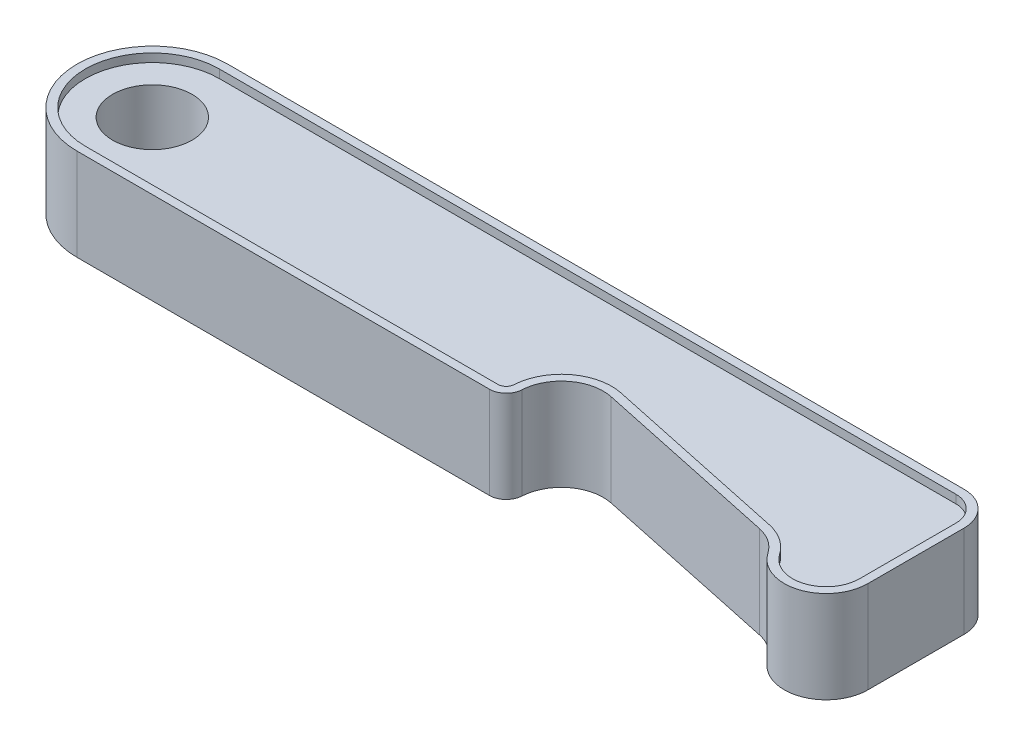
ISO-10303-21;
HEADER;
FILE_DESCRIPTION(('STEP AP214'),'2;1');
FILE_NAME('part.step','',(''),(''),'','','');
FILE_SCHEMA(('AUTOMOTIVE_DESIGN { 1 0 10303 214 1 1 1 1 }'));
ENDSEC;
DATA;
#1=APPLICATION_CONTEXT('core data for automotive mechanical design processes');
#2=APPLICATION_PROTOCOL_DEFINITION('international standard','automotive_design',2000,#1);
#3=PRODUCT_CONTEXT('',#1,'mechanical');
#4=PRODUCT('Part','Part','',(#3));
#5=PRODUCT_RELATED_PRODUCT_CATEGORY('part','',(#4));
#6=PRODUCT_DEFINITION_FORMATION('','',#4);
#7=PRODUCT_DEFINITION_CONTEXT('part definition',#1,'design');
#8=PRODUCT_DEFINITION('design','',#6,#7);
#9=PRODUCT_DEFINITION_SHAPE('','',#8);
#10=(LENGTH_UNIT() NAMED_UNIT(*) SI_UNIT(.MILLI.,.METRE.));
#11=(NAMED_UNIT(*) PLANE_ANGLE_UNIT() SI_UNIT($,.RADIAN.));
#12=(NAMED_UNIT(*) SI_UNIT($,.STERADIAN.) SOLID_ANGLE_UNIT());
#13=UNCERTAINTY_MEASURE_WITH_UNIT(LENGTH_MEASURE(1.E-05),#10,'distance_accuracy_value','');
#14=(GEOMETRIC_REPRESENTATION_CONTEXT(3) GLOBAL_UNCERTAINTY_ASSIGNED_CONTEXT((#13)) GLOBAL_UNIT_ASSIGNED_CONTEXT((#10,
#11,#12)) REPRESENTATION_CONTEXT('',''));
#15=CARTESIAN_POINT('',(0.,0.,0.));
#16=DIRECTION('',(0.,0.,1.));
#17=DIRECTION('',(1.,0.,0.));
#18=AXIS2_PLACEMENT_3D('',#15,#16,#17);
#19=CARTESIAN_POINT('',(-37.8170068432019,11.,-3.49425505754596));
#20=DIRECTION('',(0.,-1.,0.));
#21=DIRECTION('',(0.,0.,-1.));
#22=AXIS2_PLACEMENT_3D('',#19,#20,#21);
#23=CYLINDRICAL_SURFACE('',#22,4.75);
#24=CARTESIAN_POINT('',(-37.8170068432019,10.,-3.49425505754596));
#25=DIRECTION('',(0.,1.,0.));
#26=DIRECTION('',(0.,0.,1.));
#27=AXIS2_PLACEMENT_3D('',#24,#25,#26);
#28=CIRCLE('',#27,4.75);
#29=CARTESIAN_POINT('',(-37.8170068432019,10.,1.25574494245404));
#30=VERTEX_POINT('',#29);
#31=EDGE_CURVE('E356',#30,#30,#28,.F.);
#32=ORIENTED_EDGE('',*,*,#31,.F.);
#33=EDGE_LOOP('',(#32));
#34=FACE_BOUND('',#33,.T.);
#35=CARTESIAN_POINT('',(-37.8170068432019,1.,-3.49425505754596));
#36=DIRECTION('',(0.,-1.,0.));
#37=DIRECTION('',(0.,0.,-1.));
#38=AXIS2_PLACEMENT_3D('',#35,#36,#37);
#39=CIRCLE('',#38,4.75);
#40=CARTESIAN_POINT('',(-37.8170068432019,1.,-8.24425505754595));
#41=VERTEX_POINT('',#40);
#42=EDGE_CURVE('E285',#41,#41,#39,.F.);
#43=ORIENTED_EDGE('',*,*,#42,.F.);
#44=EDGE_LOOP('',(#43));
#45=FACE_BOUND('',#44,.T.);
#46=ADVANCED_FACE('F70',(#34,#45),#23,.F.);
#47=CARTESIAN_POINT('',(50.1829931567981,0.,-8.49425505754595));
#48=DIRECTION('',(0.,1.,0.));
#49=DIRECTION('',(0.,0.,1.));
#50=AXIS2_PLACEMENT_3D('',#47,#48,#49);
#51=PLANE('',#50);
#52=DIRECTION('',(1.,0.,0.));
#53=VECTOR('',#52,1.);
#54=CARTESIAN_POINT('',(-37.8170068432019,0.,-12.494255057546));
#55=LINE('',#54,#53);
#56=CARTESIAN_POINT('',(-37.8170068432019,0.,-12.494255057546));
#57=VERTEX_POINT('',#56);
#58=CARTESIAN_POINT('',(50.1829931567981,0.,-12.494255057546));
#59=VERTEX_POINT('',#58);
#60=EDGE_CURVE('E418',#57,#59,#55,.T.);
#61=ORIENTED_EDGE('',*,*,#60,.T.);
#62=CARTESIAN_POINT('',(50.1829931567981,0.,-8.49425505754595));
#63=DIRECTION('',(0.,1.,0.));
#64=DIRECTION('',(0.,0.,1.));
#65=AXIS2_PLACEMENT_3D('',#62,#63,#64);
#66=CIRCLE('',#65,4.00000000000001);
#67=CARTESIAN_POINT('',(54.1829931567981,0.,-8.49425505754595));
#68=VERTEX_POINT('',#67);
#69=EDGE_CURVE('E462',#68,#59,#66,.T.);
#70=ORIENTED_EDGE('',*,*,#69,.F.);
#71=DIRECTION('',(0.,0.,-1.));
#72=VECTOR('',#71,1.);
#73=CARTESIAN_POINT('',(54.1829931567981,0.,3.00574494245405));
#74=LINE('',#73,#72);
#75=CARTESIAN_POINT('',(54.1829931567981,0.,3.00574494245405));
#76=VERTEX_POINT('',#75);
#77=EDGE_CURVE('E465',#76,#68,#74,.T.);
#78=ORIENTED_EDGE('',*,*,#77,.F.);
#79=CARTESIAN_POINT('',(49.1829931567981,0.,3.00574494245405));
#80=DIRECTION('',(0.,1.,0.));
#81=DIRECTION('',(0.,0.,1.));
#82=AXIS2_PLACEMENT_3D('',#79,#80,#81);
#83=CIRCLE('',#82,5.);
#84=CARTESIAN_POINT('',(45.0673633932524,0.,5.84503915922999));
#85=VERTEX_POINT('',#84);
#86=EDGE_CURVE('E467',#85,#76,#83,.T.);
#87=ORIENTED_EDGE('',*,*,#86,.F.);
#88=CARTESIAN_POINT('',(40.9517336297068,0.,8.68433337600594));
#89=DIRECTION('',(0.,1.,0.));
#90=DIRECTION('',(0.,0.,1.));
#91=AXIS2_PLACEMENT_3D('',#88,#89,#90);
#92=CIRCLE('',#91,5.);
#93=CARTESIAN_POINT('',(41.9912920837956,0.,3.79359537233691));
#94=VERTEX_POINT('',#93);
#95=EDGE_CURVE('E469',#85,#94,#92,.T.);
#96=ORIENTED_EDGE('',*,*,#95,.T.);
#97=DIRECTION('',(0.978147600733805,0.,0.20791169081776));
#98=VECTOR('',#97,1.);
#99=CARTESIAN_POINT('',(19.4912920837956,0.,-0.988927265238599));
#100=LINE('',#99,#98);
#101=CARTESIAN_POINT('',(19.4912920837956,0.,-0.988927265238596));
#102=VERTEX_POINT('',#101);
#103=EDGE_CURVE('E472',#102,#94,#100,.T.);
#104=ORIENTED_EDGE('',*,*,#103,.F.);
#105=CARTESIAN_POINT('',(18.4517336297068,0.,3.90181073843043));
#106=DIRECTION('',(0.,1.,0.));
#107=DIRECTION('',(0.,0.,1.));
#108=AXIS2_PLACEMENT_3D('',#105,#106,#107);
#109=CIRCLE('',#108,5.);
#110=CARTESIAN_POINT('',(13.4597435207843,0.,3.6189065984473));
#111=VERTEX_POINT('',#110);
#112=EDGE_CURVE('E475',#102,#111,#109,.T.);
#113=ORIENTED_EDGE('',*,*,#112,.T.);
#114=CARTESIAN_POINT('',(11.4629474772153,0.,3.50574494245404));
#115=DIRECTION('',(0.,1.,0.));
#116=DIRECTION('',(0.,0.,1.));
#117=AXIS2_PLACEMENT_3D('',#114,#115,#116);
#118=CIRCLE('',#117,2.);
#119=CARTESIAN_POINT('',(11.4629474772153,0.,5.50574494245404));
#120=VERTEX_POINT('',#119);
#121=EDGE_CURVE('E478',#120,#111,#118,.T.);
#122=ORIENTED_EDGE('',*,*,#121,.F.);
#123=DIRECTION('',(1.,0.,0.));
#124=VECTOR('',#123,1.);
#125=CARTESIAN_POINT('',(-37.8170068432019,0.,5.50574494245404));
#126=LINE('',#125,#124);
#127=CARTESIAN_POINT('',(-37.8170068432019,0.,5.50574494245404));
#128=VERTEX_POINT('',#127);
#129=EDGE_CURVE('E481',#128,#120,#126,.T.);
#130=ORIENTED_EDGE('',*,*,#129,.F.);
#131=CARTESIAN_POINT('',(-37.8170068432019,0.,-3.49425505754596));
#132=DIRECTION('',(0.,1.,0.));
#133=DIRECTION('',(0.,0.,1.));
#134=AXIS2_PLACEMENT_3D('',#131,#132,#133);
#135=CIRCLE('',#134,9.);
#136=EDGE_CURVE('E440',#57,#128,#135,.T.);
#137=ORIENTED_EDGE('',*,*,#136,.F.);
#138=EDGE_LOOP('',(#61,#70,#78,#87,#96,#104,#113,#122,#130,#137));
#139=FACE_BOUND('',#138,.T.);
#140=CARTESIAN_POINT('',(18.4517336297068,0.,3.90181073843043));
#141=DIRECTION('',(0.,-1.,0.));
#142=DIRECTION('',(0.,0.,-1.));
#143=AXIS2_PLACEMENT_3D('',#140,#141,#142);
#144=CIRCLE('',#143,6.);
#145=CARTESIAN_POINT('',(12.4613454989998,0.,3.56232577045067));
#146=VERTEX_POINT('',#145);
#147=CARTESIAN_POINT('',(19.6992037746134,0.,-1.9670748659724));
#148=VERTEX_POINT('',#147);
#149=EDGE_CURVE('E87',#146,#148,#144,.T.);
#150=ORIENTED_EDGE('',*,*,#149,.T.);
#151=DIRECTION('',(-0.978147600733806,0.,-0.20791169081776));
#152=VECTOR('',#151,1.);
#153=CARTESIAN_POINT('',(1.25158353740187,0.,-5.8882375945884));
#154=LINE('',#153,#152);
#155=CARTESIAN_POINT('',(42.1992037746134,0.,2.8154477716031));
#156=VERTEX_POINT('',#155);
#157=EDGE_CURVE('E336',#156,#148,#154,.T.);
#158=ORIENTED_EDGE('',*,*,#157,.F.);
#159=CARTESIAN_POINT('',(40.9517336297068,0.,8.68433337600594));
#160=DIRECTION('',(0.,-1.,0.));
#161=DIRECTION('',(0.,0.,-1.));
#162=AXIS2_PLACEMENT_3D('',#159,#160,#161);
#163=CIRCLE('',#162,6.);
#164=CARTESIAN_POINT('',(45.8904893459616,0.,5.2771803158748));
#165=VERTEX_POINT('',#164);
#166=EDGE_CURVE('E333',#156,#165,#163,.T.);
#167=ORIENTED_EDGE('',*,*,#166,.T.);
#168=CARTESIAN_POINT('',(49.1829931567981,0.,3.00574494245405));
#169=DIRECTION('',(0.,-1.,0.));
#170=DIRECTION('',(0.,0.,-1.));
#171=AXIS2_PLACEMENT_3D('',#168,#169,#170);
#172=CIRCLE('',#171,4.);
#173=CARTESIAN_POINT('',(53.1829931567981,0.,3.00574494245405));
#174=VERTEX_POINT('',#173);
#175=EDGE_CURVE('E330',#174,#165,#172,.T.);
#176=ORIENTED_EDGE('',*,*,#175,.F.);
#177=DIRECTION('',(0.,0.,1.));
#178=VECTOR('',#177,1.);
#179=CARTESIAN_POINT('',(53.1829931567981,0.,0.));
#180=LINE('',#179,#178);
#181=CARTESIAN_POINT('',(53.1829931567981,0.,-8.49425505754595));
#182=VERTEX_POINT('',#181);
#183=EDGE_CURVE('E327',#182,#174,#180,.T.);
#184=ORIENTED_EDGE('',*,*,#183,.F.);
#185=CARTESIAN_POINT('',(50.1829931567981,0.,-8.49425505754595));
#186=DIRECTION('',(0.,-1.,0.));
#187=DIRECTION('',(0.,0.,-1.));
#188=AXIS2_PLACEMENT_3D('',#185,#186,#187);
#189=CIRCLE('',#188,3.);
#190=CARTESIAN_POINT('',(50.1829931567981,0.,-11.494255057546));
#191=VERTEX_POINT('',#190);
#192=EDGE_CURVE('E324',#191,#182,#189,.T.);
#193=ORIENTED_EDGE('',*,*,#192,.F.);
#194=DIRECTION('',(1.,0.,0.));
#195=VECTOR('',#194,1.);
#196=CARTESIAN_POINT('',(0.,0.,-11.494255057546));
#197=LINE('',#196,#195);
#198=CARTESIAN_POINT('',(-37.8170068432019,0.,-11.494255057546));
#199=VERTEX_POINT('',#198);
#200=EDGE_CURVE('E321',#199,#191,#197,.T.);
#201=ORIENTED_EDGE('',*,*,#200,.F.);
#202=CARTESIAN_POINT('',(-37.8170068432019,0.,-3.49425505754596));
#203=DIRECTION('',(0.,-1.,0.));
#204=DIRECTION('',(0.,0.,-1.));
#205=AXIS2_PLACEMENT_3D('',#202,#203,#204);
#206=CIRCLE('',#205,7.99999999999999);
#207=CARTESIAN_POINT('',(-37.8170068432019,0.,4.50574494245404));
#208=VERTEX_POINT('',#207);
#209=EDGE_CURVE('E318',#208,#199,#206,.T.);
#210=ORIENTED_EDGE('',*,*,#209,.F.);
#211=DIRECTION('',(-1.,0.,0.));
#212=VECTOR('',#211,1.);
#213=CARTESIAN_POINT('',(0.,0.,4.50574494245404));
#214=LINE('',#213,#212);
#215=CARTESIAN_POINT('',(11.4629474772153,0.,4.50574494245405));
#216=VERTEX_POINT('',#215);
#217=EDGE_CURVE('E315',#216,#208,#214,.T.);
#218=ORIENTED_EDGE('',*,*,#217,.F.);
#219=CARTESIAN_POINT('',(11.4629474772153,0.,3.50574494245404));
#220=DIRECTION('',(0.,-1.,0.));
#221=DIRECTION('',(0.,0.,-1.));
#222=AXIS2_PLACEMENT_3D('',#219,#220,#221);
#223=CIRCLE('',#222,1.);
#224=EDGE_CURVE('E313',#146,#216,#223,.T.);
#225=ORIENTED_EDGE('',*,*,#224,.F.);
#226=EDGE_LOOP('',(#150,#158,#167,#176,#184,#193,#201,#210,#218,#225));
#227=FACE_BOUND('',#226,.T.);
#228=ADVANCED_FACE('F513',(#139,#227),#51,.F.);
#229=CARTESIAN_POINT('',(50.1829931567981,11.,-8.49425505754595));
#230=DIRECTION('',(0.,1.,0.));
#231=DIRECTION('',(0.,0.,1.));
#232=AXIS2_PLACEMENT_3D('',#229,#230,#231);
#233=PLANE('',#232);
#234=DIRECTION('',(0.,0.,-1.));
#235=VECTOR('',#234,1.);
#236=CARTESIAN_POINT('',(53.1829931567981,11.,0.));
#237=LINE('',#236,#235);
#238=CARTESIAN_POINT('',(53.1829931567981,11.,3.00574494245405));
#239=VERTEX_POINT('',#238);
#240=CARTESIAN_POINT('',(53.1829931567981,11.,-8.49425505754595));
#241=VERTEX_POINT('',#240);
#242=EDGE_CURVE('E95',#239,#241,#237,.T.);
#243=ORIENTED_EDGE('',*,*,#242,.F.);
#244=CARTESIAN_POINT('',(49.1829931567981,11.,3.00574494245405));
#245=DIRECTION('',(0.,1.,0.));
#246=DIRECTION('',(0.,0.,1.));
#247=AXIS2_PLACEMENT_3D('',#244,#245,#246);
#248=CIRCLE('',#247,4.);
#249=CARTESIAN_POINT('',(45.8904893459616,11.,5.2771803158748));
#250=VERTEX_POINT('',#249);
#251=EDGE_CURVE('E360',#250,#239,#248,.T.);
#252=ORIENTED_EDGE('',*,*,#251,.F.);
#253=CARTESIAN_POINT('',(40.9517336297068,11.,8.68433337600594));
#254=DIRECTION('',(0.,1.,0.));
#255=DIRECTION('',(0.,0.,1.));
#256=AXIS2_PLACEMENT_3D('',#253,#254,#255);
#257=CIRCLE('',#256,6.);
#258=CARTESIAN_POINT('',(42.1992037746134,11.,2.81544777160311));
#259=VERTEX_POINT('',#258);
#260=EDGE_CURVE('E411',#250,#259,#257,.T.);
#261=ORIENTED_EDGE('',*,*,#260,.T.);
#262=DIRECTION('',(0.978147600733806,0.,0.20791169081776));
#263=VECTOR('',#262,1.);
#264=CARTESIAN_POINT('',(1.25158353740187,11.,-5.8882375945884));
#265=LINE('',#264,#263);
#266=CARTESIAN_POINT('',(19.6992037746134,11.,-1.9670748659724));
#267=VERTEX_POINT('',#266);
#268=EDGE_CURVE('E408',#267,#259,#265,.T.);
#269=ORIENTED_EDGE('',*,*,#268,.F.);
#270=CARTESIAN_POINT('',(18.4517336297068,11.,3.90181073843043));
#271=DIRECTION('',(0.,1.,0.));
#272=DIRECTION('',(0.,0.,1.));
#273=AXIS2_PLACEMENT_3D('',#270,#271,#272);
#274=CIRCLE('',#273,6.);
#275=CARTESIAN_POINT('',(12.4613454989998,11.,3.56232577045067));
#276=VERTEX_POINT('',#275);
#277=EDGE_CURVE('E405',#267,#276,#274,.T.);
#278=ORIENTED_EDGE('',*,*,#277,.T.);
#279=CARTESIAN_POINT('',(11.4629474772153,11.,3.50574494245404));
#280=DIRECTION('',(0.,1.,0.));
#281=DIRECTION('',(0.,0.,1.));
#282=AXIS2_PLACEMENT_3D('',#279,#280,#281);
#283=CIRCLE('',#282,1.);
#284=CARTESIAN_POINT('',(11.4629474772153,11.,4.50574494245404));
#285=VERTEX_POINT('',#284);
#286=EDGE_CURVE('E402',#285,#276,#283,.T.);
#287=ORIENTED_EDGE('',*,*,#286,.F.);
#288=DIRECTION('',(1.,0.,0.));
#289=VECTOR('',#288,1.);
#290=CARTESIAN_POINT('',(0.,11.,4.50574494245404));
#291=LINE('',#290,#289);
#292=CARTESIAN_POINT('',(-37.8170068432019,11.,4.50574494245404));
#293=VERTEX_POINT('',#292);
#294=EDGE_CURVE('E399',#293,#285,#291,.T.);
#295=ORIENTED_EDGE('',*,*,#294,.F.);
#296=CARTESIAN_POINT('',(-37.8170068432019,11.,-3.49425505754596));
#297=DIRECTION('',(0.,1.,0.));
#298=DIRECTION('',(0.,0.,1.));
#299=AXIS2_PLACEMENT_3D('',#296,#297,#298);
#300=CIRCLE('',#299,7.99999999999999);
#301=CARTESIAN_POINT('',(-37.8170068432019,11.,-11.4942550575459));
#302=VERTEX_POINT('',#301);
#303=EDGE_CURVE('E396',#302,#293,#300,.T.);
#304=ORIENTED_EDGE('',*,*,#303,.F.);
#305=DIRECTION('',(-1.,0.,0.));
#306=VECTOR('',#305,1.);
#307=CARTESIAN_POINT('',(0.,11.,-11.494255057546));
#308=LINE('',#307,#306);
#309=CARTESIAN_POINT('',(50.1829931567981,11.,-11.494255057546));
#310=VERTEX_POINT('',#309);
#311=EDGE_CURVE('E393',#310,#302,#308,.T.);
#312=ORIENTED_EDGE('',*,*,#311,.F.);
#313=CARTESIAN_POINT('',(50.1829931567981,11.,-8.49425505754595));
#314=DIRECTION('',(0.,1.,0.));
#315=DIRECTION('',(0.,0.,1.));
#316=AXIS2_PLACEMENT_3D('',#313,#314,#315);
#317=CIRCLE('',#316,3.00000000000001);
#318=EDGE_CURVE('E390',#241,#310,#317,.T.);
#319=ORIENTED_EDGE('',*,*,#318,.F.);
#320=EDGE_LOOP('',(#243,#252,#261,#269,#278,#287,#295,#304,#312,#319));
#321=FACE_BOUND('',#320,.T.);
#322=DIRECTION('',(1.,0.,0.));
#323=VECTOR('',#322,1.);
#324=CARTESIAN_POINT('',(-37.8170068432019,11.,-12.494255057546));
#325=LINE('',#324,#323);
#326=CARTESIAN_POINT('',(-37.8170068432019,11.,-12.494255057546));
#327=VERTEX_POINT('',#326);
#328=CARTESIAN_POINT('',(50.1829931567981,11.,-12.494255057546));
#329=VERTEX_POINT('',#328);
#330=EDGE_CURVE('E436',#327,#329,#325,.T.);
#331=ORIENTED_EDGE('',*,*,#330,.F.);
#332=CARTESIAN_POINT('',(-37.8170068432019,11.,-3.49425505754596));
#333=DIRECTION('',(0.,1.,0.));
#334=DIRECTION('',(0.,0.,1.));
#335=AXIS2_PLACEMENT_3D('',#332,#333,#334);
#336=CIRCLE('',#335,9.);
#337=CARTESIAN_POINT('',(-37.8170068432019,11.,5.50574494245404));
#338=VERTEX_POINT('',#337);
#339=EDGE_CURVE('E458',#327,#338,#336,.T.);
#340=ORIENTED_EDGE('',*,*,#339,.T.);
#341=DIRECTION('',(1.,0.,0.));
#342=VECTOR('',#341,1.);
#343=CARTESIAN_POINT('',(-37.8170068432019,11.,5.50574494245404));
#344=LINE('',#343,#342);
#345=CARTESIAN_POINT('',(11.4629474772153,11.,5.50574494245404));
#346=VERTEX_POINT('',#345);
#347=EDGE_CURVE('E456',#338,#346,#344,.T.);
#348=ORIENTED_EDGE('',*,*,#347,.T.);
#349=CARTESIAN_POINT('',(11.4629474772153,11.,3.50574494245404));
#350=DIRECTION('',(0.,1.,0.));
#351=DIRECTION('',(0.,0.,1.));
#352=AXIS2_PLACEMENT_3D('',#349,#350,#351);
#353=CIRCLE('',#352,2.);
#354=CARTESIAN_POINT('',(13.4597435207843,11.,3.6189065984473));
#355=VERTEX_POINT('',#354);
#356=EDGE_CURVE('E454',#346,#355,#353,.T.);
#357=ORIENTED_EDGE('',*,*,#356,.T.);
#358=CARTESIAN_POINT('',(18.4517336297068,11.,3.90181073843043));
#359=DIRECTION('',(0.,1.,0.));
#360=DIRECTION('',(0.,0.,1.));
#361=AXIS2_PLACEMENT_3D('',#358,#359,#360);
#362=CIRCLE('',#361,5.);
#363=CARTESIAN_POINT('',(19.4912920837956,11.,-0.988927265238596));
#364=VERTEX_POINT('',#363);
#365=EDGE_CURVE('E451',#364,#355,#362,.T.);
#366=ORIENTED_EDGE('',*,*,#365,.F.);
#367=DIRECTION('',(0.978147600733805,0.,0.20791169081776));
#368=VECTOR('',#367,1.);
#369=CARTESIAN_POINT('',(19.4912920837956,11.,-0.988927265238599));
#370=LINE('',#369,#368);
#371=CARTESIAN_POINT('',(41.9912920837956,11.,3.79359537233691));
#372=VERTEX_POINT('',#371);
#373=EDGE_CURVE('E449',#364,#372,#370,.T.);
#374=ORIENTED_EDGE('',*,*,#373,.T.);
#375=CARTESIAN_POINT('',(40.9517336297068,11.,8.68433337600594));
#376=DIRECTION('',(0.,1.,0.));
#377=DIRECTION('',(0.,0.,1.));
#378=AXIS2_PLACEMENT_3D('',#375,#376,#377);
#379=CIRCLE('',#378,5.);
#380=CARTESIAN_POINT('',(45.0673633932524,11.,5.84503915922999));
#381=VERTEX_POINT('',#380);
#382=EDGE_CURVE('E446',#381,#372,#379,.T.);
#383=ORIENTED_EDGE('',*,*,#382,.F.);
#384=CARTESIAN_POINT('',(49.1829931567981,11.,3.00574494245405));
#385=DIRECTION('',(0.,1.,0.));
#386=DIRECTION('',(0.,0.,1.));
#387=AXIS2_PLACEMENT_3D('',#384,#385,#386);
#388=CIRCLE('',#387,5.);
#389=CARTESIAN_POINT('',(54.1829931567981,11.,3.00574494245405));
#390=VERTEX_POINT('',#389);
#391=EDGE_CURVE('E444',#381,#390,#388,.T.);
#392=ORIENTED_EDGE('',*,*,#391,.T.);
#393=DIRECTION('',(0.,0.,-1.));
#394=VECTOR('',#393,1.);
#395=CARTESIAN_POINT('',(54.1829931567981,11.,3.00574494245405));
#396=LINE('',#395,#394);
#397=CARTESIAN_POINT('',(54.1829931567981,11.,-8.49425505754595));
#398=VERTEX_POINT('',#397);
#399=EDGE_CURVE('E442',#390,#398,#396,.T.);
#400=ORIENTED_EDGE('',*,*,#399,.T.);
#401=CARTESIAN_POINT('',(50.1829931567981,11.,-8.49425505754595));
#402=DIRECTION('',(0.,1.,0.));
#403=DIRECTION('',(0.,0.,1.));
#404=AXIS2_PLACEMENT_3D('',#401,#402,#403);
#405=CIRCLE('',#404,4.00000000000001);
#406=EDGE_CURVE('E439',#398,#329,#405,.T.);
#407=ORIENTED_EDGE('',*,*,#406,.T.);
#408=EDGE_LOOP('',(#331,#340,#348,#357,#366,#374,#383,#392,#400,#407));
#409=FACE_BOUND('',#408,.T.);
#410=ADVANCED_FACE('F527',(#321,#409),#233,.T.);
#411=CARTESIAN_POINT('',(-37.8170068432019,11.,-12.494255057546));
#412=DIRECTION('',(0.,0.,-1.));
#413=DIRECTION('',(-1.,0.,0.));
#414=AXIS2_PLACEMENT_3D('',#411,#412,#413);
#415=PLANE('',#414);
#416=ORIENTED_EDGE('',*,*,#60,.F.);
#417=DIRECTION('',(0.,-1.,0.));
#418=VECTOR('',#417,1.);
#419=CARTESIAN_POINT('',(-37.8170068432019,11.,-12.494255057546));
#420=LINE('',#419,#418);
#421=EDGE_CURVE('E12',#327,#57,#420,.T.);
#422=ORIENTED_EDGE('',*,*,#421,.F.);
#423=ORIENTED_EDGE('',*,*,#330,.T.);
#424=DIRECTION('',(0.,-1.,0.));
#425=VECTOR('',#424,1.);
#426=CARTESIAN_POINT('',(50.1829931567981,11.,-12.494255057546));
#427=LINE('',#426,#425);
#428=EDGE_CURVE('E74',#329,#59,#427,.T.);
#429=ORIENTED_EDGE('',*,*,#428,.T.);
#430=EDGE_LOOP('',(#416,#422,#423,#429));
#431=FACE_BOUND('',#430,.T.);
#432=ADVANCED_FACE('F72',(#431),#415,.T.);
#433=CARTESIAN_POINT('',(-37.8170068432019,11.,-3.49425505754596));
#434=DIRECTION('',(0.,-1.,0.));
#435=DIRECTION('',(0.,0.,-1.));
#436=AXIS2_PLACEMENT_3D('',#433,#434,#435);
#437=CYLINDRICAL_SURFACE('',#436,9.);
#438=ORIENTED_EDGE('',*,*,#136,.T.);
#439=DIRECTION('',(0.,-1.,0.));
#440=VECTOR('',#439,1.);
#441=CARTESIAN_POINT('',(-37.8170068432019,11.,5.50574494245404));
#442=LINE('',#441,#440);
#443=EDGE_CURVE('E79',#338,#128,#442,.T.);
#444=ORIENTED_EDGE('',*,*,#443,.F.);
#445=ORIENTED_EDGE('',*,*,#339,.F.);
#446=ORIENTED_EDGE('',*,*,#421,.T.);
#447=EDGE_LOOP('',(#438,#444,#445,#446));
#448=FACE_BOUND('',#447,.T.);
#449=ADVANCED_FACE('F519',(#448),#437,.T.);
#450=CARTESIAN_POINT('',(-37.8170068432019,11.,5.50574494245404));
#451=DIRECTION('',(0.,0.,-1.));
#452=DIRECTION('',(-1.,0.,0.));
#453=AXIS2_PLACEMENT_3D('',#450,#451,#452);
#454=PLANE('',#453);
#455=ORIENTED_EDGE('',*,*,#129,.T.);
#456=DIRECTION('',(0.,-1.,0.));
#457=VECTOR('',#456,1.);
#458=CARTESIAN_POINT('',(11.4629474772153,11.,5.50574494245404));
#459=LINE('',#458,#457);
#460=EDGE_CURVE('E486',#346,#120,#459,.T.);
#461=ORIENTED_EDGE('',*,*,#460,.F.);
#462=ORIENTED_EDGE('',*,*,#347,.F.);
#463=ORIENTED_EDGE('',*,*,#443,.T.);
#464=EDGE_LOOP('',(#455,#461,#462,#463));
#465=FACE_BOUND('',#464,.T.);
#466=ADVANCED_FACE('F523',(#465),#454,.F.);
#467=CARTESIAN_POINT('',(11.4629474772153,11.,3.50574494245404));
#468=DIRECTION('',(0.,-1.,0.));
#469=DIRECTION('',(0.,0.,-1.));
#470=AXIS2_PLACEMENT_3D('',#467,#468,#469);
#471=CYLINDRICAL_SURFACE('',#470,2.);
#472=ORIENTED_EDGE('',*,*,#121,.T.);
#473=DIRECTION('',(0.,-1.,0.));
#474=VECTOR('',#473,1.);
#475=CARTESIAN_POINT('',(13.4597435207843,11.,3.6189065984473));
#476=LINE('',#475,#474);
#477=EDGE_CURVE('E489',#355,#111,#476,.T.);
#478=ORIENTED_EDGE('',*,*,#477,.F.);
#479=ORIENTED_EDGE('',*,*,#356,.F.);
#480=ORIENTED_EDGE('',*,*,#460,.T.);
#481=EDGE_LOOP('',(#472,#478,#479,#480));
#482=FACE_BOUND('',#481,.T.);
#483=ADVANCED_FACE('F550',(#482),#471,.T.);
#484=CARTESIAN_POINT('',(18.4517336297068,11.,3.90181073843043));
#485=DIRECTION('',(0.,-1.,0.));
#486=DIRECTION('',(0.,0.,-1.));
#487=AXIS2_PLACEMENT_3D('',#484,#485,#486);
#488=CYLINDRICAL_SURFACE('',#487,5.);
#489=ORIENTED_EDGE('',*,*,#112,.F.);
#490=DIRECTION('',(0.,-1.,0.));
#491=VECTOR('',#490,1.);
#492=CARTESIAN_POINT('',(19.4912920837956,11.,-0.988927265238596));
#493=LINE('',#492,#491);
#494=EDGE_CURVE('E491',#364,#102,#493,.T.);
#495=ORIENTED_EDGE('',*,*,#494,.F.);
#496=ORIENTED_EDGE('',*,*,#365,.T.);
#497=ORIENTED_EDGE('',*,*,#477,.T.);
#498=EDGE_LOOP('',(#489,#495,#496,#497));
#499=FACE_BOUND('',#498,.T.);
#500=ADVANCED_FACE('F548',(#499),#488,.F.);
#501=CARTESIAN_POINT('',(19.4912920837956,11.,-0.988927265238599));
#502=DIRECTION('',(0.20791169081776,0.,-0.978147600733806));
#503=DIRECTION('',(-0.978147600733806,0.,-0.20791169081776));
#504=AXIS2_PLACEMENT_3D('',#501,#502,#503);
#505=PLANE('',#504);
#506=ORIENTED_EDGE('',*,*,#103,.T.);
#507=DIRECTION('',(0.,-1.,0.));
#508=VECTOR('',#507,1.);
#509=CARTESIAN_POINT('',(41.9912920837956,11.,3.79359537233691));
#510=LINE('',#509,#508);
#511=EDGE_CURVE('E493',#372,#94,#510,.T.);
#512=ORIENTED_EDGE('',*,*,#511,.F.);
#513=ORIENTED_EDGE('',*,*,#373,.F.);
#514=ORIENTED_EDGE('',*,*,#494,.T.);
#515=EDGE_LOOP('',(#506,#512,#513,#514));
#516=FACE_BOUND('',#515,.T.);
#517=ADVANCED_FACE('F545',(#516),#505,.F.);
#518=CARTESIAN_POINT('',(40.9517336297068,11.,8.68433337600594));
#519=DIRECTION('',(0.,-1.,0.));
#520=DIRECTION('',(0.,0.,-1.));
#521=AXIS2_PLACEMENT_3D('',#518,#519,#520);
#522=CYLINDRICAL_SURFACE('',#521,5.);
#523=ORIENTED_EDGE('',*,*,#95,.F.);
#524=DIRECTION('',(0.,-1.,0.));
#525=VECTOR('',#524,1.);
#526=CARTESIAN_POINT('',(45.0673633932524,11.,5.84503915922999));
#527=LINE('',#526,#525);
#528=EDGE_CURVE('E495',#381,#85,#527,.T.);
#529=ORIENTED_EDGE('',*,*,#528,.F.);
#530=ORIENTED_EDGE('',*,*,#382,.T.);
#531=ORIENTED_EDGE('',*,*,#511,.T.);
#532=EDGE_LOOP('',(#523,#529,#530,#531));
#533=FACE_BOUND('',#532,.T.);
#534=ADVANCED_FACE('F541',(#533),#522,.F.);
#535=CARTESIAN_POINT('',(49.1829931567981,11.,3.00574494245405));
#536=DIRECTION('',(0.,-1.,0.));
#537=DIRECTION('',(0.,0.,-1.));
#538=AXIS2_PLACEMENT_3D('',#535,#536,#537);
#539=CYLINDRICAL_SURFACE('',#538,5.);
#540=ORIENTED_EDGE('',*,*,#86,.T.);
#541=DIRECTION('',(0.,-1.,0.));
#542=VECTOR('',#541,1.);
#543=CARTESIAN_POINT('',(54.1829931567981,11.,3.00574494245405));
#544=LINE('',#543,#542);
#545=EDGE_CURVE('E497',#390,#76,#544,.T.);
#546=ORIENTED_EDGE('',*,*,#545,.F.);
#547=ORIENTED_EDGE('',*,*,#391,.F.);
#548=ORIENTED_EDGE('',*,*,#528,.T.);
#549=EDGE_LOOP('',(#540,#546,#547,#548));
#550=FACE_BOUND('',#549,.T.);
#551=ADVANCED_FACE('F773',(#550),#539,.T.);
#552=CARTESIAN_POINT('',(54.1829931567981,11.,3.00574494245405));
#553=DIRECTION('',(-1.,0.,0.));
#554=DIRECTION('',(0.,0.,1.));
#555=AXIS2_PLACEMENT_3D('',#552,#553,#554);
#556=PLANE('',#555);
#557=ORIENTED_EDGE('',*,*,#77,.T.);
#558=DIRECTION('',(0.,-1.,0.));
#559=VECTOR('',#558,1.);
#560=CARTESIAN_POINT('',(54.1829931567981,11.,-8.49425505754595));
#561=LINE('',#560,#559);
#562=EDGE_CURVE('E499',#398,#68,#561,.T.);
#563=ORIENTED_EDGE('',*,*,#562,.F.);
#564=ORIENTED_EDGE('',*,*,#399,.F.);
#565=ORIENTED_EDGE('',*,*,#545,.T.);
#566=EDGE_LOOP('',(#557,#563,#564,#565));
#567=FACE_BOUND('',#566,.T.);
#568=ADVANCED_FACE('F535',(#567),#556,.F.);
#569=CARTESIAN_POINT('',(50.1829931567981,11.,-8.49425505754595));
#570=DIRECTION('',(0.,-1.,0.));
#571=DIRECTION('',(0.,0.,-1.));
#572=AXIS2_PLACEMENT_3D('',#569,#570,#571);
#573=CYLINDRICAL_SURFACE('',#572,4.00000000000001);
#574=ORIENTED_EDGE('',*,*,#69,.T.);
#575=ORIENTED_EDGE('',*,*,#428,.F.);
#576=ORIENTED_EDGE('',*,*,#406,.F.);
#577=ORIENTED_EDGE('',*,*,#562,.T.);
#578=EDGE_LOOP('',(#574,#575,#576,#577));
#579=FACE_BOUND('',#578,.T.);
#580=ADVANCED_FACE('F509',(#579),#573,.T.);
#581=CARTESIAN_POINT('',(53.1829931567981,10.,0.));
#582=DIRECTION('',(1.,0.,0.));
#583=DIRECTION('',(0.,0.,-1.));
#584=AXIS2_PLACEMENT_3D('',#581,#582,#583);
#585=PLANE('',#584);
#586=ORIENTED_EDGE('',*,*,#242,.T.);
#587=DIRECTION('',(0.,1.,0.));
#588=VECTOR('',#587,1.);
#589=CARTESIAN_POINT('',(53.1829931567981,10.,-8.49425505754595));
#590=LINE('',#589,#588);
#591=CARTESIAN_POINT('',(53.1829931567981,10.,-8.49425505754595));
#592=VERTEX_POINT('',#591);
#593=EDGE_CURVE('E388',#592,#241,#590,.T.);
#594=ORIENTED_EDGE('',*,*,#593,.F.);
#595=DIRECTION('',(0.,0.,-1.));
#596=VECTOR('',#595,1.);
#597=CARTESIAN_POINT('',(53.1829931567981,10.,0.));
#598=LINE('',#597,#596);
#599=CARTESIAN_POINT('',(53.1829931567981,10.,3.00574494245405));
#600=VERTEX_POINT('',#599);
#601=EDGE_CURVE('E359',#600,#592,#598,.T.);
#602=ORIENTED_EDGE('',*,*,#601,.F.);
#603=DIRECTION('',(0.,1.,0.));
#604=VECTOR('',#603,1.);
#605=CARTESIAN_POINT('',(53.1829931567981,10.,3.00574494245405));
#606=LINE('',#605,#604);
#607=EDGE_CURVE('E416',#600,#239,#606,.T.);
#608=ORIENTED_EDGE('',*,*,#607,.T.);
#609=EDGE_LOOP('',(#586,#594,#602,#608));
#610=FACE_BOUND('',#609,.T.);
#611=ADVANCED_FACE('F570',(#610),#585,.F.);
#612=CARTESIAN_POINT('',(49.1829931567981,10.,3.00574494245405));
#613=DIRECTION('',(0.,1.,0.));
#614=DIRECTION('',(0.,0.,1.));
#615=AXIS2_PLACEMENT_3D('',#612,#613,#614);
#616=CYLINDRICAL_SURFACE('',#615,4.);
#617=ORIENTED_EDGE('',*,*,#251,.T.);
#618=ORIENTED_EDGE('',*,*,#607,.F.);
#619=CARTESIAN_POINT('',(49.1829931567981,10.,3.00574494245405));
#620=DIRECTION('',(0.,1.,0.));
#621=DIRECTION('',(0.,0.,1.));
#622=AXIS2_PLACEMENT_3D('',#619,#620,#621);
#623=CIRCLE('',#622,4.);
#624=CARTESIAN_POINT('',(45.8904893459616,10.,5.2771803158748));
#625=VERTEX_POINT('',#624);
#626=EDGE_CURVE('E385',#625,#600,#623,.T.);
#627=ORIENTED_EDGE('',*,*,#626,.F.);
#628=DIRECTION('',(0.,1.,0.));
#629=VECTOR('',#628,1.);
#630=CARTESIAN_POINT('',(45.8904893459616,10.,5.2771803158748));
#631=LINE('',#630,#629);
#632=EDGE_CURVE('E419',#625,#250,#631,.T.);
#633=ORIENTED_EDGE('',*,*,#632,.T.);
#634=EDGE_LOOP('',(#617,#618,#627,#633));
#635=FACE_BOUND('',#634,.T.);
#636=ADVANCED_FACE('F711',(#635),#616,.F.);
#637=CARTESIAN_POINT('',(40.9517336297068,10.,8.68433337600594));
#638=DIRECTION('',(0.,1.,0.));
#639=DIRECTION('',(0.,0.,1.));
#640=AXIS2_PLACEMENT_3D('',#637,#638,#639);
#641=CYLINDRICAL_SURFACE('',#640,6.);
#642=ORIENTED_EDGE('',*,*,#260,.F.);
#643=ORIENTED_EDGE('',*,*,#632,.F.);
#644=CARTESIAN_POINT('',(40.9517336297068,10.,8.68433337600594));
#645=DIRECTION('',(0.,1.,0.));
#646=DIRECTION('',(0.,0.,1.));
#647=AXIS2_PLACEMENT_3D('',#644,#645,#646);
#648=CIRCLE('',#647,6.);
#649=CARTESIAN_POINT('',(42.1992037746134,10.,2.81544777160311));
#650=VERTEX_POINT('',#649);
#651=EDGE_CURVE('E383',#625,#650,#648,.T.);
#652=ORIENTED_EDGE('',*,*,#651,.T.);
#653=DIRECTION('',(0.,1.,0.));
#654=VECTOR('',#653,1.);
#655=CARTESIAN_POINT('',(42.1992037746134,10.,2.81544777160311));
#656=LINE('',#655,#654);
#657=EDGE_CURVE('E421',#650,#259,#656,.T.);
#658=ORIENTED_EDGE('',*,*,#657,.T.);
#659=EDGE_LOOP('',(#642,#643,#652,#658));
#660=FACE_BOUND('',#659,.T.);
#661=ADVANCED_FACE('F714',(#660),#641,.T.);
#662=CARTESIAN_POINT('',(1.25158353740187,10.,-5.8882375945884));
#663=DIRECTION('',(-0.20791169081776,0.,0.978147600733806));
#664=DIRECTION('',(0.978147600733806,0.,0.20791169081776));
#665=AXIS2_PLACEMENT_3D('',#662,#663,#664);
#666=PLANE('',#665);
#667=ORIENTED_EDGE('',*,*,#268,.T.);
#668=ORIENTED_EDGE('',*,*,#657,.F.);
#669=DIRECTION('',(0.978147600733806,0.,0.20791169081776));
#670=VECTOR('',#669,1.);
#671=CARTESIAN_POINT('',(1.25158353740187,10.,-5.8882375945884));
#672=LINE('',#671,#670);
#673=CARTESIAN_POINT('',(19.6992037746134,10.,-1.9670748659724));
#674=VERTEX_POINT('',#673);
#675=EDGE_CURVE('E380',#674,#650,#672,.T.);
#676=ORIENTED_EDGE('',*,*,#675,.F.);
#677=DIRECTION('',(0.,1.,0.));
#678=VECTOR('',#677,1.);
#679=CARTESIAN_POINT('',(19.6992037746134,10.,-1.9670748659724));
#680=LINE('',#679,#678);
#681=EDGE_CURVE('E423',#674,#267,#680,.T.);
#682=ORIENTED_EDGE('',*,*,#681,.T.);
#683=EDGE_LOOP('',(#667,#668,#676,#682));
#684=FACE_BOUND('',#683,.T.);
#685=ADVANCED_FACE('F718',(#684),#666,.F.);
#686=CARTESIAN_POINT('',(18.4517336297068,10.,3.90181073843043));
#687=DIRECTION('',(0.,1.,0.));
#688=DIRECTION('',(0.,0.,1.));
#689=AXIS2_PLACEMENT_3D('',#686,#687,#688);
#690=CYLINDRICAL_SURFACE('',#689,6.);
#691=ORIENTED_EDGE('',*,*,#277,.F.);
#692=ORIENTED_EDGE('',*,*,#681,.F.);
#693=CARTESIAN_POINT('',(18.4517336297068,10.,3.90181073843043));
#694=DIRECTION('',(0.,1.,0.));
#695=DIRECTION('',(0.,0.,1.));
#696=AXIS2_PLACEMENT_3D('',#693,#694,#695);
#697=CIRCLE('',#696,6.);
#698=CARTESIAN_POINT('',(12.4613454989998,10.,3.56232577045067));
#699=VERTEX_POINT('',#698);
#700=EDGE_CURVE('E378',#674,#699,#697,.T.);
#701=ORIENTED_EDGE('',*,*,#700,.T.);
#702=DIRECTION('',(0.,1.,0.));
#703=VECTOR('',#702,1.);
#704=CARTESIAN_POINT('',(12.4613454989998,10.,3.56232577045067));
#705=LINE('',#704,#703);
#706=EDGE_CURVE('E425',#699,#276,#705,.T.);
#707=ORIENTED_EDGE('',*,*,#706,.T.);
#708=EDGE_LOOP('',(#691,#692,#701,#707));
#709=FACE_BOUND('',#708,.T.);
#710=ADVANCED_FACE('F722',(#709),#690,.T.);
#711=CARTESIAN_POINT('',(11.4629474772153,10.,3.50574494245404));
#712=DIRECTION('',(0.,1.,0.));
#713=DIRECTION('',(0.,0.,1.));
#714=AXIS2_PLACEMENT_3D('',#711,#712,#713);
#715=CYLINDRICAL_SURFACE('',#714,1.);
#716=ORIENTED_EDGE('',*,*,#286,.T.);
#717=ORIENTED_EDGE('',*,*,#706,.F.);
#718=CARTESIAN_POINT('',(11.4629474772153,10.,3.50574494245404));
#719=DIRECTION('',(0.,1.,0.));
#720=DIRECTION('',(0.,0.,1.));
#721=AXIS2_PLACEMENT_3D('',#718,#719,#720);
#722=CIRCLE('',#721,1.);
#723=CARTESIAN_POINT('',(11.4629474772153,10.,4.50574494245404));
#724=VERTEX_POINT('',#723);
#725=EDGE_CURVE('E375',#724,#699,#722,.T.);
#726=ORIENTED_EDGE('',*,*,#725,.F.);
#727=DIRECTION('',(0.,1.,0.));
#728=VECTOR('',#727,1.);
#729=CARTESIAN_POINT('',(11.4629474772153,10.,4.50574494245404));
#730=LINE('',#729,#728);
#731=EDGE_CURVE('E427',#724,#285,#730,.T.);
#732=ORIENTED_EDGE('',*,*,#731,.T.);
#733=EDGE_LOOP('',(#716,#717,#726,#732));
#734=FACE_BOUND('',#733,.T.);
#735=ADVANCED_FACE('F726',(#734),#715,.F.);
#736=CARTESIAN_POINT('',(0.,10.,4.50574494245404));
#737=DIRECTION('',(0.,0.,1.));
#738=DIRECTION('',(1.,0.,0.));
#739=AXIS2_PLACEMENT_3D('',#736,#737,#738);
#740=PLANE('',#739);
#741=ORIENTED_EDGE('',*,*,#294,.T.);
#742=ORIENTED_EDGE('',*,*,#731,.F.);
#743=DIRECTION('',(1.,0.,0.));
#744=VECTOR('',#743,1.);
#745=CARTESIAN_POINT('',(0.,10.,4.50574494245404));
#746=LINE('',#745,#744);
#747=CARTESIAN_POINT('',(-37.8170068432019,10.,4.50574494245404));
#748=VERTEX_POINT('',#747);
#749=EDGE_CURVE('E372',#748,#724,#746,.T.);
#750=ORIENTED_EDGE('',*,*,#749,.F.);
#751=DIRECTION('',(0.,1.,0.));
#752=VECTOR('',#751,1.);
#753=CARTESIAN_POINT('',(-37.8170068432019,10.,4.50574494245404));
#754=LINE('',#753,#752);
#755=EDGE_CURVE('E429',#748,#293,#754,.T.);
#756=ORIENTED_EDGE('',*,*,#755,.T.);
#757=EDGE_LOOP('',(#741,#742,#750,#756));
#758=FACE_BOUND('',#757,.T.);
#759=ADVANCED_FACE('F730',(#758),#740,.F.);
#760=CARTESIAN_POINT('',(-37.8170068432019,10.,-3.49425505754596));
#761=DIRECTION('',(0.,1.,0.));
#762=DIRECTION('',(0.,0.,1.));
#763=AXIS2_PLACEMENT_3D('',#760,#761,#762);
#764=CYLINDRICAL_SURFACE('',#763,7.99999999999999);
#765=ORIENTED_EDGE('',*,*,#303,.T.);
#766=ORIENTED_EDGE('',*,*,#755,.F.);
#767=CARTESIAN_POINT('',(-37.8170068432019,10.,-3.49425505754596));
#768=DIRECTION('',(0.,1.,0.));
#769=DIRECTION('',(0.,0.,1.));
#770=AXIS2_PLACEMENT_3D('',#767,#768,#769);
#771=CIRCLE('',#770,7.99999999999999);
#772=CARTESIAN_POINT('',(-37.8170068432019,10.,-11.4942550575459));
#773=VERTEX_POINT('',#772);
#774=EDGE_CURVE('E369',#773,#748,#771,.T.);
#775=ORIENTED_EDGE('',*,*,#774,.F.);
#776=DIRECTION('',(0.,1.,0.));
#777=VECTOR('',#776,1.);
#778=CARTESIAN_POINT('',(-37.8170068432019,10.,-11.4942550575459));
#779=LINE('',#778,#777);
#780=EDGE_CURVE('E431',#773,#302,#779,.T.);
#781=ORIENTED_EDGE('',*,*,#780,.T.);
#782=EDGE_LOOP('',(#765,#766,#775,#781));
#783=FACE_BOUND('',#782,.T.);
#784=ADVANCED_FACE('F734',(#783),#764,.F.);
#785=CARTESIAN_POINT('',(0.,10.,-11.494255057546));
#786=DIRECTION('',(0.,0.,-1.));
#787=DIRECTION('',(-1.,0.,0.));
#788=AXIS2_PLACEMENT_3D('',#785,#786,#787);
#789=PLANE('',#788);
#790=ORIENTED_EDGE('',*,*,#311,.T.);
#791=ORIENTED_EDGE('',*,*,#780,.F.);
#792=DIRECTION('',(-1.,0.,0.));
#793=VECTOR('',#792,1.);
#794=CARTESIAN_POINT('',(0.,10.,-11.494255057546));
#795=LINE('',#794,#793);
#796=CARTESIAN_POINT('',(50.1829931567981,10.,-11.494255057546));
#797=VERTEX_POINT('',#796);
#798=EDGE_CURVE('E366',#797,#773,#795,.T.);
#799=ORIENTED_EDGE('',*,*,#798,.F.);
#800=DIRECTION('',(0.,1.,0.));
#801=VECTOR('',#800,1.);
#802=CARTESIAN_POINT('',(50.1829931567981,10.,-11.494255057546));
#803=LINE('',#802,#801);
#804=EDGE_CURVE('E433',#797,#310,#803,.T.);
#805=ORIENTED_EDGE('',*,*,#804,.T.);
#806=EDGE_LOOP('',(#790,#791,#799,#805));
#807=FACE_BOUND('',#806,.T.);
#808=ADVANCED_FACE('F738',(#807),#789,.F.);
#809=CARTESIAN_POINT('',(50.1829931567981,10.,-8.49425505754595));
#810=DIRECTION('',(0.,1.,0.));
#811=DIRECTION('',(0.,0.,1.));
#812=AXIS2_PLACEMENT_3D('',#809,#810,#811);
#813=CYLINDRICAL_SURFACE('',#812,3.00000000000001);
#814=ORIENTED_EDGE('',*,*,#318,.T.);
#815=ORIENTED_EDGE('',*,*,#804,.F.);
#816=CARTESIAN_POINT('',(50.1829931567981,10.,-8.49425505754595));
#817=DIRECTION('',(0.,1.,0.));
#818=DIRECTION('',(0.,0.,1.));
#819=AXIS2_PLACEMENT_3D('',#816,#817,#818);
#820=CIRCLE('',#819,3.00000000000001);
#821=EDGE_CURVE('E363',#592,#797,#820,.T.);
#822=ORIENTED_EDGE('',*,*,#821,.F.);
#823=ORIENTED_EDGE('',*,*,#593,.T.);
#824=EDGE_LOOP('',(#814,#815,#822,#823));
#825=FACE_BOUND('',#824,.T.);
#826=ADVANCED_FACE('F709',(#825),#813,.F.);
#827=CARTESIAN_POINT('',(0.,10.,0.));
#828=DIRECTION('',(0.,1.,0.));
#829=DIRECTION('',(0.,0.,1.));
#830=AXIS2_PLACEMENT_3D('',#827,#828,#829);
#831=PLANE('',#830);
#832=ORIENTED_EDGE('',*,*,#31,.T.);
#833=EDGE_LOOP('',(#832));
#834=FACE_BOUND('',#833,.T.);
#835=ORIENTED_EDGE('',*,*,#601,.T.);
#836=ORIENTED_EDGE('',*,*,#821,.T.);
#837=ORIENTED_EDGE('',*,*,#798,.T.);
#838=ORIENTED_EDGE('',*,*,#774,.T.);
#839=ORIENTED_EDGE('',*,*,#749,.T.);
#840=ORIENTED_EDGE('',*,*,#725,.T.);
#841=ORIENTED_EDGE('',*,*,#700,.F.);
#842=ORIENTED_EDGE('',*,*,#675,.T.);
#843=ORIENTED_EDGE('',*,*,#651,.F.);
#844=ORIENTED_EDGE('',*,*,#626,.T.);
#845=EDGE_LOOP('',(#835,#836,#837,#838,#839,#840,#841,#842,#843,#844));
#846=FACE_BOUND('',#845,.T.);
#847=ADVANCED_FACE('F605',(#834,#846),#831,.T.);
#848=CARTESIAN_POINT('',(18.4517336297068,1.,3.90181073843043));
#849=DIRECTION('',(0.,-1.,0.));
#850=DIRECTION('',(0.,0.,-1.));
#851=AXIS2_PLACEMENT_3D('',#848,#849,#850);
#852=CYLINDRICAL_SURFACE('',#851,6.);
#853=ORIENTED_EDGE('',*,*,#149,.F.);
#854=DIRECTION('',(0.,-1.,0.));
#855=VECTOR('',#854,1.);
#856=CARTESIAN_POINT('',(12.4613454989998,1.,3.56232577045067));
#857=LINE('',#856,#855);
#858=CARTESIAN_POINT('',(12.4613454989998,1.,3.56232577045067));
#859=VERTEX_POINT('',#858);
#860=EDGE_CURVE('E265',#859,#146,#857,.T.);
#861=ORIENTED_EDGE('',*,*,#860,.F.);
#862=CARTESIAN_POINT('',(18.4517336297068,1.,3.90181073843043));
#863=DIRECTION('',(0.,-1.,0.));
#864=DIRECTION('',(0.,0.,-1.));
#865=AXIS2_PLACEMENT_3D('',#862,#863,#864);
#866=CIRCLE('',#865,6.);
#867=CARTESIAN_POINT('',(19.6992037746134,1.,-1.9670748659724));
#868=VERTEX_POINT('',#867);
#869=EDGE_CURVE('E268',#859,#868,#866,.T.);
#870=ORIENTED_EDGE('',*,*,#869,.T.);
#871=DIRECTION('',(0.,-1.,0.));
#872=VECTOR('',#871,1.);
#873=CARTESIAN_POINT('',(19.6992037746134,1.,-1.9670748659724));
#874=LINE('',#873,#872);
#875=EDGE_CURVE('E339',#868,#148,#874,.T.);
#876=ORIENTED_EDGE('',*,*,#875,.T.);
#877=EDGE_LOOP('',(#853,#861,#870,#876));
#878=FACE_BOUND('',#877,.T.);
#879=ADVANCED_FACE('F267',(#878),#852,.T.);
#880=CARTESIAN_POINT('',(1.25158353740187,1.,-5.8882375945884));
#881=DIRECTION('',(-0.20791169081776,0.,0.978147600733806));
#882=DIRECTION('',(0.978147600733806,0.,0.20791169081776));
#883=AXIS2_PLACEMENT_3D('',#880,#881,#882);
#884=PLANE('',#883);
#885=ORIENTED_EDGE('',*,*,#157,.T.);
#886=ORIENTED_EDGE('',*,*,#875,.F.);
#887=DIRECTION('',(-0.978147600733806,0.,-0.20791169081776));
#888=VECTOR('',#887,1.);
#889=CARTESIAN_POINT('',(1.25158353740187,1.,-5.8882375945884));
#890=LINE('',#889,#888);
#891=CARTESIAN_POINT('',(42.1992037746134,1.,2.8154477716031));
#892=VERTEX_POINT('',#891);
#893=EDGE_CURVE('E275',#892,#868,#890,.T.);
#894=ORIENTED_EDGE('',*,*,#893,.F.);
#895=DIRECTION('',(0.,-1.,0.));
#896=VECTOR('',#895,1.);
#897=CARTESIAN_POINT('',(42.1992037746134,1.,2.8154477716031));
#898=LINE('',#897,#896);
#899=EDGE_CURVE('E341',#892,#156,#898,.T.);
#900=ORIENTED_EDGE('',*,*,#899,.T.);
#901=EDGE_LOOP('',(#885,#886,#894,#900));
#902=FACE_BOUND('',#901,.T.);
#903=ADVANCED_FACE('F604',(#902),#884,.F.);
#904=CARTESIAN_POINT('',(40.9517336297068,1.,8.68433337600594));
#905=DIRECTION('',(0.,-1.,0.));
#906=DIRECTION('',(0.,0.,-1.));
#907=AXIS2_PLACEMENT_3D('',#904,#905,#906);
#908=CYLINDRICAL_SURFACE('',#907,6.);
#909=ORIENTED_EDGE('',*,*,#166,.F.);
#910=ORIENTED_EDGE('',*,*,#899,.F.);
#911=CARTESIAN_POINT('',(40.9517336297068,1.,8.68433337600594));
#912=DIRECTION('',(0.,-1.,0.));
#913=DIRECTION('',(0.,0.,-1.));
#914=AXIS2_PLACEMENT_3D('',#911,#912,#913);
#915=CIRCLE('',#914,6.);
#916=CARTESIAN_POINT('',(45.8904893459616,1.,5.2771803158748));
#917=VERTEX_POINT('',#916);
#918=EDGE_CURVE('E309',#892,#917,#915,.T.);
#919=ORIENTED_EDGE('',*,*,#918,.T.);
#920=DIRECTION('',(0.,-1.,0.));
#921=VECTOR('',#920,1.);
#922=CARTESIAN_POINT('',(45.8904893459616,1.,5.2771803158748));
#923=LINE('',#922,#921);
#924=EDGE_CURVE('E343',#917,#165,#923,.T.);
#925=ORIENTED_EDGE('',*,*,#924,.T.);
#926=EDGE_LOOP('',(#909,#910,#919,#925));
#927=FACE_BOUND('',#926,.T.);
#928=ADVANCED_FACE('F615',(#927),#908,.T.);
#929=CARTESIAN_POINT('',(49.1829931567981,1.,3.00574494245405));
#930=DIRECTION('',(0.,-1.,0.));
#931=DIRECTION('',(0.,0.,-1.));
#932=AXIS2_PLACEMENT_3D('',#929,#930,#931);
#933=CYLINDRICAL_SURFACE('',#932,4.);
#934=ORIENTED_EDGE('',*,*,#175,.T.);
#935=ORIENTED_EDGE('',*,*,#924,.F.);
#936=CARTESIAN_POINT('',(49.1829931567981,1.,3.00574494245405));
#937=DIRECTION('',(0.,-1.,0.));
#938=DIRECTION('',(0.,0.,-1.));
#939=AXIS2_PLACEMENT_3D('',#936,#937,#938);
#940=CIRCLE('',#939,4.);
#941=CARTESIAN_POINT('',(53.1829931567981,1.,3.00574494245405));
#942=VERTEX_POINT('',#941);
#943=EDGE_CURVE('E306',#942,#917,#940,.T.);
#944=ORIENTED_EDGE('',*,*,#943,.F.);
#945=DIRECTION('',(0.,-1.,0.));
#946=VECTOR('',#945,1.);
#947=CARTESIAN_POINT('',(53.1829931567981,1.,3.00574494245405));
#948=LINE('',#947,#946);
#949=EDGE_CURVE('E345',#942,#174,#948,.T.);
#950=ORIENTED_EDGE('',*,*,#949,.T.);
#951=EDGE_LOOP('',(#934,#935,#944,#950));
#952=FACE_BOUND('',#951,.T.);
#953=ADVANCED_FACE('F625',(#952),#933,.F.);
#954=CARTESIAN_POINT('',(53.1829931567981,1.,0.));
#955=DIRECTION('',(1.,0.,0.));
#956=DIRECTION('',(0.,0.,-1.));
#957=AXIS2_PLACEMENT_3D('',#954,#955,#956);
#958=PLANE('',#957);
#959=ORIENTED_EDGE('',*,*,#183,.T.);
#960=ORIENTED_EDGE('',*,*,#949,.F.);
#961=DIRECTION('',(0.,0.,1.));
#962=VECTOR('',#961,1.);
#963=CARTESIAN_POINT('',(53.1829931567981,1.,0.));
#964=LINE('',#963,#962);
#965=CARTESIAN_POINT('',(53.1829931567981,1.,-8.49425505754595));
#966=VERTEX_POINT('',#965);
#967=EDGE_CURVE('E303',#966,#942,#964,.T.);
#968=ORIENTED_EDGE('',*,*,#967,.F.);
#969=DIRECTION('',(0.,-1.,0.));
#970=VECTOR('',#969,1.);
#971=CARTESIAN_POINT('',(53.1829931567981,1.,-8.49425505754595));
#972=LINE('',#971,#970);
#973=EDGE_CURVE('E347',#966,#182,#972,.T.);
#974=ORIENTED_EDGE('',*,*,#973,.T.);
#975=EDGE_LOOP('',(#959,#960,#968,#974));
#976=FACE_BOUND('',#975,.T.);
#977=ADVANCED_FACE('F635',(#976),#958,.F.);
#978=CARTESIAN_POINT('',(50.1829931567981,1.,-8.49425505754595));
#979=DIRECTION('',(0.,-1.,0.));
#980=DIRECTION('',(0.,0.,-1.));
#981=AXIS2_PLACEMENT_3D('',#978,#979,#980);
#982=CYLINDRICAL_SURFACE('',#981,3.);
#983=ORIENTED_EDGE('',*,*,#192,.T.);
#984=ORIENTED_EDGE('',*,*,#973,.F.);
#985=CARTESIAN_POINT('',(50.1829931567981,1.,-8.49425505754595));
#986=DIRECTION('',(0.,-1.,0.));
#987=DIRECTION('',(0.,0.,-1.));
#988=AXIS2_PLACEMENT_3D('',#985,#986,#987);
#989=CIRCLE('',#988,3.);
#990=CARTESIAN_POINT('',(50.1829931567981,1.,-11.494255057546));
#991=VERTEX_POINT('',#990);
#992=EDGE_CURVE('E300',#991,#966,#989,.T.);
#993=ORIENTED_EDGE('',*,*,#992,.F.);
#994=DIRECTION('',(0.,-1.,0.));
#995=VECTOR('',#994,1.);
#996=CARTESIAN_POINT('',(50.1829931567981,1.,-11.494255057546));
#997=LINE('',#996,#995);
#998=EDGE_CURVE('E349',#991,#191,#997,.T.);
#999=ORIENTED_EDGE('',*,*,#998,.T.);
#1000=EDGE_LOOP('',(#983,#984,#993,#999));
#1001=FACE_BOUND('',#1000,.T.);
#1002=ADVANCED_FACE('F645',(#1001),#982,.F.);
#1003=CARTESIAN_POINT('',(0.,1.,-11.494255057546));
#1004=DIRECTION('',(0.,0.,-1.));
#1005=DIRECTION('',(-1.,0.,0.));
#1006=AXIS2_PLACEMENT_3D('',#1003,#1004,#1005);
#1007=PLANE('',#1006);
#1008=ORIENTED_EDGE('',*,*,#200,.T.);
#1009=ORIENTED_EDGE('',*,*,#998,.F.);
#1010=DIRECTION('',(1.,0.,0.));
#1011=VECTOR('',#1010,1.);
#1012=CARTESIAN_POINT('',(0.,1.,-11.494255057546));
#1013=LINE('',#1012,#1011);
#1014=CARTESIAN_POINT('',(-37.8170068432019,1.,-11.494255057546));
#1015=VERTEX_POINT('',#1014);
#1016=EDGE_CURVE('E297',#1015,#991,#1013,.T.);
#1017=ORIENTED_EDGE('',*,*,#1016,.F.);
#1018=DIRECTION('',(0.,-1.,0.));
#1019=VECTOR('',#1018,1.);
#1020=CARTESIAN_POINT('',(-37.8170068432019,1.,-11.494255057546));
#1021=LINE('',#1020,#1019);
#1022=EDGE_CURVE('E351',#1015,#199,#1021,.T.);
#1023=ORIENTED_EDGE('',*,*,#1022,.T.);
#1024=EDGE_LOOP('',(#1008,#1009,#1017,#1023));
#1025=FACE_BOUND('',#1024,.T.);
#1026=ADVANCED_FACE('F655',(#1025),#1007,.F.);
#1027=CARTESIAN_POINT('',(-37.8170068432019,1.,-3.49425505754596));
#1028=DIRECTION('',(0.,-1.,0.));
#1029=DIRECTION('',(0.,0.,-1.));
#1030=AXIS2_PLACEMENT_3D('',#1027,#1028,#1029);
#1031=CYLINDRICAL_SURFACE('',#1030,7.99999999999999);
#1032=ORIENTED_EDGE('',*,*,#209,.T.);
#1033=ORIENTED_EDGE('',*,*,#1022,.F.);
#1034=CARTESIAN_POINT('',(-37.8170068432019,1.,-3.49425505754596));
#1035=DIRECTION('',(0.,-1.,0.));
#1036=DIRECTION('',(0.,0.,-1.));
#1037=AXIS2_PLACEMENT_3D('',#1034,#1035,#1036);
#1038=CIRCLE('',#1037,7.99999999999999);
#1039=CARTESIAN_POINT('',(-37.8170068432019,1.,4.50574494245404));
#1040=VERTEX_POINT('',#1039);
#1041=EDGE_CURVE('E291',#1040,#1015,#1038,.T.);
#1042=ORIENTED_EDGE('',*,*,#1041,.F.);
#1043=DIRECTION('',(0.,-1.,0.));
#1044=VECTOR('',#1043,1.);
#1045=CARTESIAN_POINT('',(-37.8170068432019,1.,4.50574494245404));
#1046=LINE('',#1045,#1044);
#1047=EDGE_CURVE('E353',#1040,#208,#1046,.T.);
#1048=ORIENTED_EDGE('',*,*,#1047,.T.);
#1049=EDGE_LOOP('',(#1032,#1033,#1042,#1048));
#1050=FACE_BOUND('',#1049,.T.);
#1051=ADVANCED_FACE('F665',(#1050),#1031,.F.);
#1052=CARTESIAN_POINT('',(0.,1.,4.50574494245404));
#1053=DIRECTION('',(0.,0.,1.));
#1054=DIRECTION('',(1.,0.,0.));
#1055=AXIS2_PLACEMENT_3D('',#1052,#1053,#1054);
#1056=PLANE('',#1055);
#1057=ORIENTED_EDGE('',*,*,#217,.T.);
#1058=ORIENTED_EDGE('',*,*,#1047,.F.);
#1059=DIRECTION('',(-1.,0.,0.));
#1060=VECTOR('',#1059,1.);
#1061=CARTESIAN_POINT('',(0.,1.,4.50574494245404));
#1062=LINE('',#1061,#1060);
#1063=CARTESIAN_POINT('',(11.4629474772153,1.,4.50574494245405));
#1064=VERTEX_POINT('',#1063);
#1065=EDGE_CURVE('E289',#1064,#1040,#1062,.T.);
#1066=ORIENTED_EDGE('',*,*,#1065,.F.);
#1067=DIRECTION('',(0.,-1.,0.));
#1068=VECTOR('',#1067,1.);
#1069=CARTESIAN_POINT('',(11.4629474772153,1.,4.50574494245405));
#1070=LINE('',#1069,#1068);
#1071=EDGE_CURVE('E274',#1064,#216,#1070,.T.);
#1072=ORIENTED_EDGE('',*,*,#1071,.T.);
#1073=EDGE_LOOP('',(#1057,#1058,#1066,#1072));
#1074=FACE_BOUND('',#1073,.T.);
#1075=ADVANCED_FACE('F675',(#1074),#1056,.F.);
#1076=CARTESIAN_POINT('',(11.4629474772153,1.,3.50574494245404));
#1077=DIRECTION('',(0.,-1.,0.));
#1078=DIRECTION('',(0.,0.,-1.));
#1079=AXIS2_PLACEMENT_3D('',#1076,#1077,#1078);
#1080=CYLINDRICAL_SURFACE('',#1079,1.);
#1081=ORIENTED_EDGE('',*,*,#224,.T.);
#1082=ORIENTED_EDGE('',*,*,#1071,.F.);
#1083=CARTESIAN_POINT('',(11.4629474772153,1.,3.50574494245404));
#1084=DIRECTION('',(0.,-1.,0.));
#1085=DIRECTION('',(0.,0.,-1.));
#1086=AXIS2_PLACEMENT_3D('',#1083,#1084,#1085);
#1087=CIRCLE('',#1086,1.);
#1088=EDGE_CURVE('E282',#859,#1064,#1087,.T.);
#1089=ORIENTED_EDGE('',*,*,#1088,.F.);
#1090=ORIENTED_EDGE('',*,*,#860,.T.);
#1091=EDGE_LOOP('',(#1081,#1082,#1089,#1090));
#1092=FACE_BOUND('',#1091,.T.);
#1093=ADVANCED_FACE('F287',(#1092),#1080,.F.);
#1094=CARTESIAN_POINT('',(0.,1.,0.));
#1095=DIRECTION('',(0.,-1.,0.));
#1096=DIRECTION('',(0.,0.,-1.));
#1097=AXIS2_PLACEMENT_3D('',#1094,#1095,#1096);
#1098=PLANE('',#1097);
#1099=ORIENTED_EDGE('',*,*,#42,.T.);
#1100=EDGE_LOOP('',(#1099));
#1101=FACE_BOUND('',#1100,.T.);
#1102=ORIENTED_EDGE('',*,*,#869,.F.);
#1103=ORIENTED_EDGE('',*,*,#1088,.T.);
#1104=ORIENTED_EDGE('',*,*,#1065,.T.);
#1105=ORIENTED_EDGE('',*,*,#1041,.T.);
#1106=ORIENTED_EDGE('',*,*,#1016,.T.);
#1107=ORIENTED_EDGE('',*,*,#992,.T.);
#1108=ORIENTED_EDGE('',*,*,#967,.T.);
#1109=ORIENTED_EDGE('',*,*,#943,.T.);
#1110=ORIENTED_EDGE('',*,*,#918,.F.);
#1111=ORIENTED_EDGE('',*,*,#893,.T.);
#1112=EDGE_LOOP('',(#1102,#1103,#1104,#1105,#1106,#1107,#1108,#1109,#1110,#1111));
#1113=FACE_BOUND('',#1112,.T.);
#1114=ADVANCED_FACE('F280',(#1101,#1113),#1098,.T.);
#1115=CLOSED_SHELL('',(#46,#228,#410,#432,#449,#466,#483,#500,#517,#534,#551,#568,#580,#611,
#636,#661,#685,#710,#735,#759,#784,#808,#826,#847,#879,#903,#928,#953,#977,#1002,#1026,#1051,
#1075,#1093,#1114));
#1116=MANIFOLD_SOLID_BREP('B2',#1115);
#1117=ADVANCED_BREP_SHAPE_REPRESENTATION('',(#18,#1116),#14);
#1118=SHAPE_DEFINITION_REPRESENTATION(#9,#1117);
ENDSEC;
END-ISO-10303-21;
